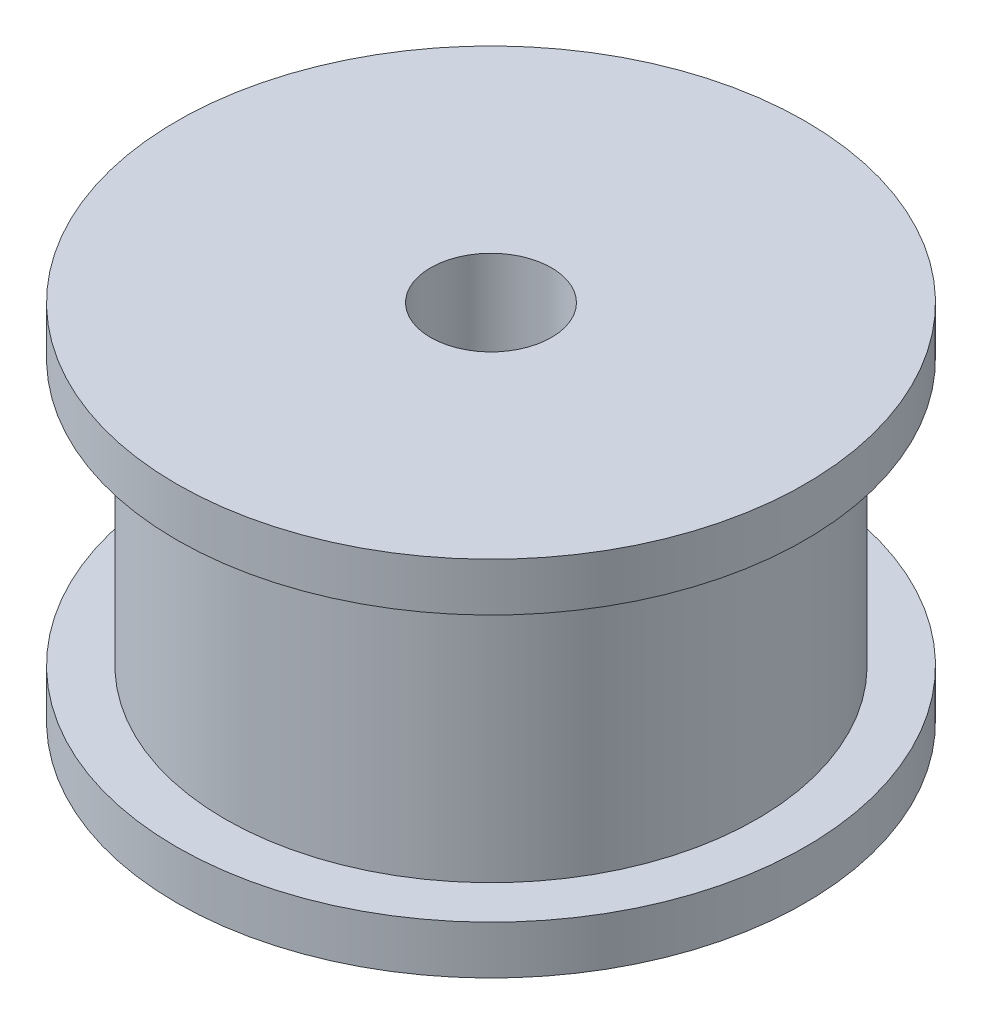
ISO-10303-21;
HEADER;
FILE_DESCRIPTION(('STEP AP214'),'2;1');
FILE_NAME('part.step','',(''),(''),'','','');
FILE_SCHEMA(('AUTOMOTIVE_DESIGN { 1 0 10303 214 1 1 1 1 }'));
ENDSEC;
DATA;
#1=APPLICATION_CONTEXT('core data for automotive mechanical design processes');
#2=APPLICATION_PROTOCOL_DEFINITION('international standard','automotive_design',2000,#1);
#3=PRODUCT_CONTEXT('',#1,'mechanical');
#4=PRODUCT('Part','Part','',(#3));
#5=PRODUCT_RELATED_PRODUCT_CATEGORY('part','',(#4));
#6=PRODUCT_DEFINITION_FORMATION('','',#4);
#7=PRODUCT_DEFINITION_CONTEXT('part definition',#1,'design');
#8=PRODUCT_DEFINITION('design','',#6,#7);
#9=PRODUCT_DEFINITION_SHAPE('','',#8);
#10=(LENGTH_UNIT() NAMED_UNIT(*) SI_UNIT(.MILLI.,.METRE.));
#11=(NAMED_UNIT(*) PLANE_ANGLE_UNIT() SI_UNIT($,.RADIAN.));
#12=(NAMED_UNIT(*) SI_UNIT($,.STERADIAN.) SOLID_ANGLE_UNIT());
#13=UNCERTAINTY_MEASURE_WITH_UNIT(LENGTH_MEASURE(1.E-05),#10,'distance_accuracy_value','');
#14=(GEOMETRIC_REPRESENTATION_CONTEXT(3) GLOBAL_UNCERTAINTY_ASSIGNED_CONTEXT((#13)) GLOBAL_UNIT_ASSIGNED_CONTEXT((#10,
#11,#12)) REPRESENTATION_CONTEXT('',''));
#15=CARTESIAN_POINT('',(0.,0.,0.));
#16=DIRECTION('',(0.,0.,1.));
#17=DIRECTION('',(1.,0.,0.));
#18=AXIS2_PLACEMENT_3D('',#15,#16,#17);
#19=CARTESIAN_POINT('',(0.,2.,0.));
#20=DIRECTION('',(0.,-1.,0.));
#21=DIRECTION('',(0.,0.,-1.));
#22=AXIS2_PLACEMENT_3D('',#19,#20,#21);
#23=CYLINDRICAL_SURFACE('',#22,13.);
#24=CARTESIAN_POINT('',(0.,2.,0.));
#25=DIRECTION('',(0.,1.,0.));
#26=DIRECTION('',(0.,0.,1.));
#27=AXIS2_PLACEMENT_3D('',#24,#25,#26);
#28=CIRCLE('',#27,13.);
#29=CARTESIAN_POINT('',(0.,2.,13.));
#30=VERTEX_POINT('',#29);
#31=EDGE_CURVE('E44',#30,#30,#28,.T.);
#32=ORIENTED_EDGE('',*,*,#31,.F.);
#33=EDGE_LOOP('',(#32));
#34=FACE_BOUND('',#33,.T.);
#35=CARTESIAN_POINT('',(0.,0.,0.));
#36=DIRECTION('',(0.,1.,0.));
#37=DIRECTION('',(0.,0.,1.));
#38=AXIS2_PLACEMENT_3D('',#35,#36,#37);
#39=CIRCLE('',#38,13.);
#40=CARTESIAN_POINT('',(0.,0.,13.));
#41=VERTEX_POINT('',#40);
#42=EDGE_CURVE('E40',#41,#41,#39,.T.);
#43=ORIENTED_EDGE('',*,*,#42,.T.);
#44=EDGE_LOOP('',(#43));
#45=FACE_BOUND('',#44,.T.);
#46=ADVANCED_FACE('F37',(#34,#45),#23,.T.);
#47=CARTESIAN_POINT('',(0.,2.,0.));
#48=DIRECTION('',(0.,1.,0.));
#49=DIRECTION('',(0.,0.,1.));
#50=AXIS2_PLACEMENT_3D('',#47,#48,#49);
#51=PLANE('',#50);
#52=CARTESIAN_POINT('',(0.,2.,0.));
#53=DIRECTION('',(0.,1.,0.));
#54=DIRECTION('',(0.,0.,1.));
#55=AXIS2_PLACEMENT_3D('',#52,#53,#54);
#56=CIRCLE('',#55,11.);
#57=CARTESIAN_POINT('',(0.,2.,11.));
#58=VERTEX_POINT('',#57);
#59=EDGE_CURVE('E10',#58,#58,#56,.T.);
#60=ORIENTED_EDGE('',*,*,#59,.F.);
#61=EDGE_LOOP('',(#60));
#62=FACE_BOUND('',#61,.T.);
#63=ORIENTED_EDGE('',*,*,#31,.T.);
#64=EDGE_LOOP('',(#63));
#65=FACE_BOUND('',#64,.T.);
#66=ADVANCED_FACE('F92',(#62,#65),#51,.T.);
#67=CARTESIAN_POINT('',(0.,0.,0.));
#68=DIRECTION('',(0.,1.,0.));
#69=DIRECTION('',(0.,0.,1.));
#70=AXIS2_PLACEMENT_3D('',#67,#68,#69);
#71=PLANE('',#70);
#72=CARTESIAN_POINT('',(0.,0.,0.));
#73=DIRECTION('',(0.,1.,0.));
#74=DIRECTION('',(0.,0.,1.));
#75=AXIS2_PLACEMENT_3D('',#72,#73,#74);
#76=CIRCLE('',#75,2.50000000000001);
#77=CARTESIAN_POINT('',(0.,0.,2.50000000000001));
#78=VERTEX_POINT('',#77);
#79=EDGE_CURVE('E57',#78,#78,#76,.T.);
#80=ORIENTED_EDGE('',*,*,#79,.T.);
#81=EDGE_LOOP('',(#80));
#82=FACE_BOUND('',#81,.T.);
#83=ORIENTED_EDGE('',*,*,#42,.F.);
#84=EDGE_LOOP('',(#83));
#85=FACE_BOUND('',#84,.T.);
#86=ADVANCED_FACE('F97',(#82,#85),#71,.F.);
#87=CARTESIAN_POINT('',(0.,13.,0.));
#88=DIRECTION('',(0.,-1.,0.));
#89=DIRECTION('',(0.,0.,-1.));
#90=AXIS2_PLACEMENT_3D('',#87,#88,#89);
#91=CYLINDRICAL_SURFACE('',#90,11.);
#92=CARTESIAN_POINT('',(0.,13.,0.));
#93=DIRECTION('',(0.,1.,0.));
#94=DIRECTION('',(0.,0.,1.));
#95=AXIS2_PLACEMENT_3D('',#92,#93,#94);
#96=CIRCLE('',#95,11.);
#97=CARTESIAN_POINT('',(0.,13.,11.));
#98=VERTEX_POINT('',#97);
#99=EDGE_CURVE('E50',#98,#98,#96,.T.);
#100=ORIENTED_EDGE('',*,*,#99,.F.);
#101=EDGE_LOOP('',(#100));
#102=FACE_BOUND('',#101,.T.);
#103=ORIENTED_EDGE('',*,*,#59,.T.);
#104=EDGE_LOOP('',(#103));
#105=FACE_BOUND('',#104,.T.);
#106=ADVANCED_FACE('F78',(#102,#105),#91,.T.);
#107=CARTESIAN_POINT('',(0.,15.,0.));
#108=DIRECTION('',(0.,-1.,0.));
#109=DIRECTION('',(0.,0.,-1.));
#110=AXIS2_PLACEMENT_3D('',#107,#108,#109);
#111=CYLINDRICAL_SURFACE('',#110,13.);
#112=CARTESIAN_POINT('',(0.,15.,0.));
#113=DIRECTION('',(0.,1.,0.));
#114=DIRECTION('',(0.,0.,1.));
#115=AXIS2_PLACEMENT_3D('',#112,#113,#114);
#116=CIRCLE('',#115,13.);
#117=CARTESIAN_POINT('',(0.,15.,13.));
#118=VERTEX_POINT('',#117);
#119=EDGE_CURVE('E53',#118,#118,#116,.T.);
#120=ORIENTED_EDGE('',*,*,#119,.F.);
#121=EDGE_LOOP('',(#120));
#122=FACE_BOUND('',#121,.T.);
#123=CARTESIAN_POINT('',(0.,13.,0.));
#124=DIRECTION('',(0.,1.,0.));
#125=DIRECTION('',(0.,0.,1.));
#126=AXIS2_PLACEMENT_3D('',#123,#124,#125);
#127=CIRCLE('',#126,13.);
#128=CARTESIAN_POINT('',(0.,13.,13.));
#129=VERTEX_POINT('',#128);
#130=EDGE_CURVE('E54',#129,#129,#127,.T.);
#131=ORIENTED_EDGE('',*,*,#130,.T.);
#132=EDGE_LOOP('',(#131));
#133=FACE_BOUND('',#132,.T.);
#134=ADVANCED_FACE('F72',(#122,#133),#111,.T.);
#135=CARTESIAN_POINT('',(0.,15.,0.));
#136=DIRECTION('',(0.,1.,0.));
#137=DIRECTION('',(0.,0.,1.));
#138=AXIS2_PLACEMENT_3D('',#135,#136,#137);
#139=PLANE('',#138);
#140=CARTESIAN_POINT('',(0.,15.,0.));
#141=DIRECTION('',(0.,1.,0.));
#142=DIRECTION('',(0.,0.,1.));
#143=AXIS2_PLACEMENT_3D('',#140,#141,#142);
#144=CIRCLE('',#143,2.50000000000001);
#145=CARTESIAN_POINT('',(0.,15.,2.50000000000001));
#146=VERTEX_POINT('',#145);
#147=EDGE_CURVE('E62',#146,#146,#144,.T.);
#148=ORIENTED_EDGE('',*,*,#147,.F.);
#149=EDGE_LOOP('',(#148));
#150=FACE_BOUND('',#149,.T.);
#151=ORIENTED_EDGE('',*,*,#119,.T.);
#152=EDGE_LOOP('',(#151));
#153=FACE_BOUND('',#152,.T.);
#154=ADVANCED_FACE('F68',(#150,#153),#139,.T.);
#155=CARTESIAN_POINT('',(0.,13.,0.));
#156=DIRECTION('',(0.,1.,0.));
#157=DIRECTION('',(0.,0.,1.));
#158=AXIS2_PLACEMENT_3D('',#155,#156,#157);
#159=PLANE('',#158);
#160=ORIENTED_EDGE('',*,*,#99,.T.);
#161=EDGE_LOOP('',(#160));
#162=FACE_BOUND('',#161,.T.);
#163=ORIENTED_EDGE('',*,*,#130,.F.);
#164=EDGE_LOOP('',(#163));
#165=FACE_BOUND('',#164,.T.);
#166=ADVANCED_FACE('F71',(#162,#165),#159,.F.);
#167=CARTESIAN_POINT('',(0.,15.,0.));
#168=DIRECTION('',(0.,1.,0.));
#169=DIRECTION('',(0.,0.,1.));
#170=AXIS2_PLACEMENT_3D('',#167,#168,#169);
#171=CYLINDRICAL_SURFACE('',#170,2.50000000000001);
#172=ORIENTED_EDGE('',*,*,#79,.F.);
#173=EDGE_LOOP('',(#172));
#174=FACE_BOUND('',#173,.T.);
#175=ORIENTED_EDGE('',*,*,#147,.T.);
#176=EDGE_LOOP('',(#175));
#177=FACE_BOUND('',#176,.T.);
#178=ADVANCED_FACE('F66',(#174,#177),#171,.F.);
#179=CLOSED_SHELL('',(#46,#66,#86,#106,#134,#154,#166,#178));
#180=MANIFOLD_SOLID_BREP('B2',#179);
#181=ADVANCED_BREP_SHAPE_REPRESENTATION('',(#18,#180),#14);
#182=SHAPE_DEFINITION_REPRESENTATION(#9,#181);
ENDSEC;
END-ISO-10303-21;
